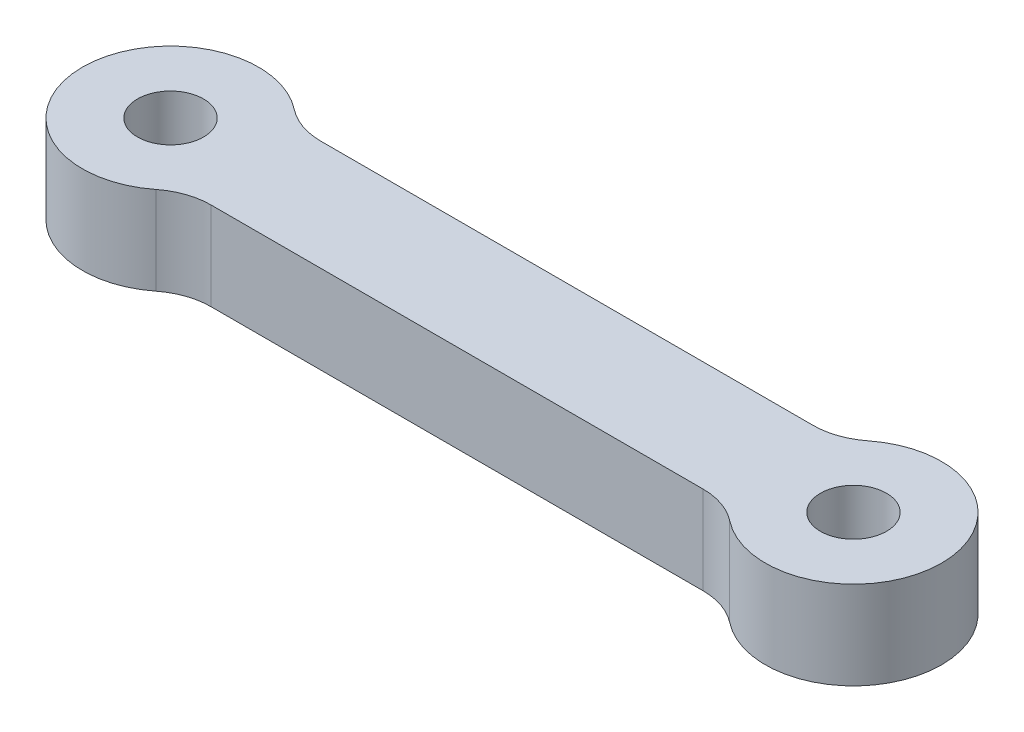
ISO-10303-21;
HEADER;
FILE_DESCRIPTION(('STEP AP214'),'2;1');
FILE_NAME('part.step','',(''),(''),'','','');
FILE_SCHEMA(('AUTOMOTIVE_DESIGN { 1 0 10303 214 1 1 1 1 }'));
ENDSEC;
DATA;
#1=APPLICATION_CONTEXT('core data for automotive mechanical design processes');
#2=APPLICATION_PROTOCOL_DEFINITION('international standard','automotive_design',2000,#1);
#3=PRODUCT_CONTEXT('',#1,'mechanical');
#4=PRODUCT('Part','Part','',(#3));
#5=PRODUCT_RELATED_PRODUCT_CATEGORY('part','',(#4));
#6=PRODUCT_DEFINITION_FORMATION('','',#4);
#7=PRODUCT_DEFINITION_CONTEXT('part definition',#1,'design');
#8=PRODUCT_DEFINITION('design','',#6,#7);
#9=PRODUCT_DEFINITION_SHAPE('','',#8);
#10=(LENGTH_UNIT() NAMED_UNIT(*) SI_UNIT(.MILLI.,.METRE.));
#11=(NAMED_UNIT(*) PLANE_ANGLE_UNIT() SI_UNIT($,.RADIAN.));
#12=(NAMED_UNIT(*) SI_UNIT($,.STERADIAN.) SOLID_ANGLE_UNIT());
#13=UNCERTAINTY_MEASURE_WITH_UNIT(LENGTH_MEASURE(1.E-05),#10,'distance_accuracy_value','');
#14=(GEOMETRIC_REPRESENTATION_CONTEXT(3) GLOBAL_UNCERTAINTY_ASSIGNED_CONTEXT((#13)) GLOBAL_UNIT_ASSIGNED_CONTEXT((#10,
#11,#12)) REPRESENTATION_CONTEXT('',''));
#15=CARTESIAN_POINT('',(0.,0.,0.));
#16=DIRECTION('',(0.,0.,1.));
#17=DIRECTION('',(1.,0.,0.));
#18=AXIS2_PLACEMENT_3D('',#15,#16,#17);
#19=CARTESIAN_POINT('',(11.1698729810778,4.,-5.5));
#20=DIRECTION('',(0.,-1.,0.));
#21=DIRECTION('',(0.,0.,-1.));
#22=AXIS2_PLACEMENT_3D('',#19,#20,#21);
#23=PLANE('',#22);
#24=CARTESIAN_POINT('',(11.1698729810778,4.,-5.5));
#25=DIRECTION('',(0.,-1.,0.));
#26=DIRECTION('',(0.,0.,-1.));
#27=AXIS2_PLACEMENT_3D('',#24,#25,#26);
#28=CIRCLE('',#27,3.);
#29=CARTESIAN_POINT('',(13.025641703473,4.,-3.14285714285714));
#30=VERTEX_POINT('',#29);
#31=CARTESIAN_POINT('',(11.1698729810778,4.,-2.5));
#32=VERTEX_POINT('',#31);
#33=EDGE_CURVE('E145',#30,#32,#28,.T.);
#34=ORIENTED_EDGE('',*,*,#33,.T.);
#35=DIRECTION('',(-1.,0.,0.));
#36=VECTOR('',#35,1.);
#37=CARTESIAN_POINT('',(11.1698729810778,4.,-2.5));
#38=LINE('',#37,#36);
#39=CARTESIAN_POINT('',(-11.1698729810778,4.,-2.5));
#40=VERTEX_POINT('',#39);
#41=EDGE_CURVE('E93',#32,#40,#38,.T.);
#42=ORIENTED_EDGE('',*,*,#41,.T.);
#43=CARTESIAN_POINT('',(-11.1698729810778,4.,-5.5));
#44=DIRECTION('',(0.,-1.,0.));
#45=DIRECTION('',(0.,0.,-1.));
#46=AXIS2_PLACEMENT_3D('',#43,#44,#45);
#47=CIRCLE('',#46,3.);
#48=CARTESIAN_POINT('',(-13.025641703473,4.,-3.14285714285714));
#49=VERTEX_POINT('',#48);
#50=EDGE_CURVE('E160',#40,#49,#47,.T.);
#51=ORIENTED_EDGE('',*,*,#50,.T.);
#52=CARTESIAN_POINT('',(-15.5,4.,0.));
#53=DIRECTION('',(0.,1.,0.));
#54=DIRECTION('',(0.,0.,1.));
#55=AXIS2_PLACEMENT_3D('',#52,#53,#54);
#56=CIRCLE('',#55,4.);
#57=CARTESIAN_POINT('',(-13.025641703473,4.,3.14285714285714));
#58=VERTEX_POINT('',#57);
#59=EDGE_CURVE('E173',#49,#58,#56,.T.);
#60=ORIENTED_EDGE('',*,*,#59,.T.);
#61=CARTESIAN_POINT('',(-11.1698729810778,4.,5.5));
#62=DIRECTION('',(0.,-1.,0.));
#63=DIRECTION('',(0.,0.,1.));
#64=AXIS2_PLACEMENT_3D('',#61,#62,#63);
#65=CIRCLE('',#64,3.);
#66=CARTESIAN_POINT('',(-11.1698729810778,4.,2.5));
#67=VERTEX_POINT('',#66);
#68=EDGE_CURVE('E112',#58,#67,#65,.T.);
#69=ORIENTED_EDGE('',*,*,#68,.T.);
#70=DIRECTION('',(1.,0.,0.));
#71=VECTOR('',#70,1.);
#72=CARTESIAN_POINT('',(11.1698729810778,4.,2.5));
#73=LINE('',#72,#71);
#74=CARTESIAN_POINT('',(11.1698729810778,4.,2.5));
#75=VERTEX_POINT('',#74);
#76=EDGE_CURVE('E106',#67,#75,#73,.T.);
#77=ORIENTED_EDGE('',*,*,#76,.T.);
#78=CARTESIAN_POINT('',(11.1698729810778,4.,5.5));
#79=DIRECTION('',(0.,-1.,0.));
#80=DIRECTION('',(0.,0.,-1.));
#81=AXIS2_PLACEMENT_3D('',#78,#79,#80);
#82=CIRCLE('',#81,3.);
#83=CARTESIAN_POINT('',(13.025641703473,4.,3.14285714285714));
#84=VERTEX_POINT('',#83);
#85=EDGE_CURVE('E110',#75,#84,#82,.T.);
#86=ORIENTED_EDGE('',*,*,#85,.T.);
#87=CARTESIAN_POINT('',(15.5,4.,0.));
#88=DIRECTION('',(0.,1.,0.));
#89=DIRECTION('',(0.,0.,-1.));
#90=AXIS2_PLACEMENT_3D('',#87,#88,#89);
#91=CIRCLE('',#90,4.);
#92=EDGE_CURVE('E50',#84,#30,#91,.T.);
#93=ORIENTED_EDGE('',*,*,#92,.T.);
#94=EDGE_LOOP('',(#34,#42,#51,#60,#69,#77,#86,#93));
#95=FACE_BOUND('',#94,.T.);
#96=CARTESIAN_POINT('',(-15.5,4.,0.));
#97=DIRECTION('',(0.,1.,0.));
#98=DIRECTION('',(0.,0.,1.));
#99=AXIS2_PLACEMENT_3D('',#96,#97,#98);
#100=CIRCLE('',#99,1.5);
#101=CARTESIAN_POINT('',(-15.5,4.,1.5));
#102=VERTEX_POINT('',#101);
#103=EDGE_CURVE('E134',#102,#102,#100,.T.);
#104=ORIENTED_EDGE('',*,*,#103,.F.);
#105=EDGE_LOOP('',(#104));
#106=FACE_BOUND('',#105,.T.);
#107=CARTESIAN_POINT('',(15.5,4.,0.));
#108=DIRECTION('',(0.,1.,0.));
#109=DIRECTION('',(0.,0.,-1.));
#110=AXIS2_PLACEMENT_3D('',#107,#108,#109);
#111=CIRCLE('',#110,1.5);
#112=CARTESIAN_POINT('',(15.5,4.,-1.5));
#113=VERTEX_POINT('',#112);
#114=EDGE_CURVE('E182',#113,#113,#111,.T.);
#115=ORIENTED_EDGE('',*,*,#114,.F.);
#116=EDGE_LOOP('',(#115));
#117=FACE_BOUND('',#116,.T.);
#118=ADVANCED_FACE('F33',(#95,#106,#117),#23,.F.);
#119=CARTESIAN_POINT('',(11.1698729810778,0.,-5.5));
#120=DIRECTION('',(0.,-1.,0.));
#121=DIRECTION('',(0.,0.,-1.));
#122=AXIS2_PLACEMENT_3D('',#119,#120,#121);
#123=PLANE('',#122);
#124=CARTESIAN_POINT('',(-15.5,0.,0.));
#125=DIRECTION('',(0.,1.,0.));
#126=DIRECTION('',(0.,0.,1.));
#127=AXIS2_PLACEMENT_3D('',#124,#125,#126);
#128=CIRCLE('',#127,1.5);
#129=CARTESIAN_POINT('',(-15.5,0.,1.5));
#130=VERTEX_POINT('',#129);
#131=EDGE_CURVE('E179',#130,#130,#128,.T.);
#132=ORIENTED_EDGE('',*,*,#131,.T.);
#133=EDGE_LOOP('',(#132));
#134=FACE_BOUND('',#133,.T.);
#135=CARTESIAN_POINT('',(11.1698729810778,0.,-5.5));
#136=DIRECTION('',(0.,-1.,0.));
#137=DIRECTION('',(0.,0.,-1.));
#138=AXIS2_PLACEMENT_3D('',#135,#136,#137);
#139=CIRCLE('',#138,3.);
#140=CARTESIAN_POINT('',(13.025641703473,0.,-3.14285714285714));
#141=VERTEX_POINT('',#140);
#142=CARTESIAN_POINT('',(11.1698729810778,0.,-2.5));
#143=VERTEX_POINT('',#142);
#144=EDGE_CURVE('E130',#141,#143,#139,.T.);
#145=ORIENTED_EDGE('',*,*,#144,.F.);
#146=CARTESIAN_POINT('',(15.5,0.,0.));
#147=DIRECTION('',(0.,1.,0.));
#148=DIRECTION('',(0.,0.,-1.));
#149=AXIS2_PLACEMENT_3D('',#146,#147,#148);
#150=CIRCLE('',#149,4.);
#151=CARTESIAN_POINT('',(13.025641703473,0.,3.14285714285714));
#152=VERTEX_POINT('',#151);
#153=EDGE_CURVE('E85',#152,#141,#150,.T.);
#154=ORIENTED_EDGE('',*,*,#153,.F.);
#155=CARTESIAN_POINT('',(11.1698729810778,0.,5.5));
#156=DIRECTION('',(0.,-1.,0.));
#157=DIRECTION('',(0.,0.,-1.));
#158=AXIS2_PLACEMENT_3D('',#155,#156,#157);
#159=CIRCLE('',#158,3.);
#160=CARTESIAN_POINT('',(11.1698729810778,0.,2.5));
#161=VERTEX_POINT('',#160);
#162=EDGE_CURVE('E79',#161,#152,#159,.T.);
#163=ORIENTED_EDGE('',*,*,#162,.F.);
#164=DIRECTION('',(1.,0.,0.));
#165=VECTOR('',#164,1.);
#166=CARTESIAN_POINT('',(11.1698729810778,0.,2.5));
#167=LINE('',#166,#165);
#168=CARTESIAN_POINT('',(-11.1698729810778,0.,2.5));
#169=VERTEX_POINT('',#168);
#170=EDGE_CURVE('E120',#169,#161,#167,.T.);
#171=ORIENTED_EDGE('',*,*,#170,.F.);
#172=CARTESIAN_POINT('',(-11.1698729810778,0.,5.5));
#173=DIRECTION('',(0.,-1.,0.));
#174=DIRECTION('',(0.,0.,1.));
#175=AXIS2_PLACEMENT_3D('',#172,#173,#174);
#176=CIRCLE('',#175,3.);
#177=CARTESIAN_POINT('',(-13.025641703473,0.,3.14285714285714));
#178=VERTEX_POINT('',#177);
#179=EDGE_CURVE('E140',#178,#169,#176,.T.);
#180=ORIENTED_EDGE('',*,*,#179,.F.);
#181=CARTESIAN_POINT('',(-15.5,0.,0.));
#182=DIRECTION('',(0.,1.,0.));
#183=DIRECTION('',(0.,0.,1.));
#184=AXIS2_PLACEMENT_3D('',#181,#182,#183);
#185=CIRCLE('',#184,4.);
#186=CARTESIAN_POINT('',(-13.025641703473,0.,-3.14285714285714));
#187=VERTEX_POINT('',#186);
#188=EDGE_CURVE('E138',#187,#178,#185,.T.);
#189=ORIENTED_EDGE('',*,*,#188,.F.);
#190=CARTESIAN_POINT('',(-11.1698729810778,0.,-5.5));
#191=DIRECTION('',(0.,-1.,0.));
#192=DIRECTION('',(0.,0.,-1.));
#193=AXIS2_PLACEMENT_3D('',#190,#191,#192);
#194=CIRCLE('',#193,3.);
#195=CARTESIAN_POINT('',(-11.1698729810778,0.,-2.5));
#196=VERTEX_POINT('',#195);
#197=EDGE_CURVE('E136',#196,#187,#194,.T.);
#198=ORIENTED_EDGE('',*,*,#197,.F.);
#199=DIRECTION('',(-1.,0.,0.));
#200=VECTOR('',#199,1.);
#201=CARTESIAN_POINT('',(11.1698729810778,0.,-2.5));
#202=LINE('',#201,#200);
#203=EDGE_CURVE('E133',#143,#196,#202,.T.);
#204=ORIENTED_EDGE('',*,*,#203,.F.);
#205=EDGE_LOOP('',(#145,#154,#163,#171,#180,#189,#198,#204));
#206=FACE_BOUND('',#205,.T.);
#207=CARTESIAN_POINT('',(15.5,0.,0.));
#208=DIRECTION('',(0.,1.,0.));
#209=DIRECTION('',(0.,0.,-1.));
#210=AXIS2_PLACEMENT_3D('',#207,#208,#209);
#211=CIRCLE('',#210,1.5);
#212=CARTESIAN_POINT('',(15.5,0.,-1.5));
#213=VERTEX_POINT('',#212);
#214=EDGE_CURVE('E185',#213,#213,#211,.T.);
#215=ORIENTED_EDGE('',*,*,#214,.T.);
#216=EDGE_LOOP('',(#215));
#217=FACE_BOUND('',#216,.T.);
#218=ADVANCED_FACE('F164',(#134,#206,#217),#123,.T.);
#219=CARTESIAN_POINT('',(11.1698729810778,4.,-5.5));
#220=DIRECTION('',(0.,-1.,0.));
#221=DIRECTION('',(0.,0.,-1.));
#222=AXIS2_PLACEMENT_3D('',#219,#220,#221);
#223=CYLINDRICAL_SURFACE('',#222,3.);
#224=ORIENTED_EDGE('',*,*,#144,.T.);
#225=DIRECTION('',(0.,-1.,0.));
#226=VECTOR('',#225,1.);
#227=CARTESIAN_POINT('',(11.1698729810778,4.,-2.5));
#228=LINE('',#227,#226);
#229=EDGE_CURVE('E11',#32,#143,#228,.T.);
#230=ORIENTED_EDGE('',*,*,#229,.F.);
#231=ORIENTED_EDGE('',*,*,#33,.F.);
#232=DIRECTION('',(0.,-1.,0.));
#233=VECTOR('',#232,1.);
#234=CARTESIAN_POINT('',(13.025641703473,4.,-3.14285714285714));
#235=LINE('',#234,#233);
#236=EDGE_CURVE('E126',#30,#141,#235,.T.);
#237=ORIENTED_EDGE('',*,*,#236,.T.);
#238=EDGE_LOOP('',(#224,#230,#231,#237));
#239=FACE_BOUND('',#238,.T.);
#240=ADVANCED_FACE('F35',(#239),#223,.F.);
#241=CARTESIAN_POINT('',(11.1698729810778,4.,-2.5));
#242=DIRECTION('',(0.,0.,1.));
#243=DIRECTION('',(1.,0.,0.));
#244=AXIS2_PLACEMENT_3D('',#241,#242,#243);
#245=PLANE('',#244);
#246=ORIENTED_EDGE('',*,*,#203,.T.);
#247=DIRECTION('',(0.,-1.,0.));
#248=VECTOR('',#247,1.);
#249=CARTESIAN_POINT('',(-11.1698729810778,4.,-2.5));
#250=LINE('',#249,#248);
#251=EDGE_CURVE('E42',#40,#196,#250,.T.);
#252=ORIENTED_EDGE('',*,*,#251,.F.);
#253=ORIENTED_EDGE('',*,*,#41,.F.);
#254=ORIENTED_EDGE('',*,*,#229,.T.);
#255=EDGE_LOOP('',(#246,#252,#253,#254));
#256=FACE_BOUND('',#255,.T.);
#257=ADVANCED_FACE('F217',(#256),#245,.F.);
#258=CARTESIAN_POINT('',(-11.1698729810778,4.,-5.5));
#259=DIRECTION('',(0.,-1.,0.));
#260=DIRECTION('',(0.,0.,-1.));
#261=AXIS2_PLACEMENT_3D('',#258,#259,#260);
#262=CYLINDRICAL_SURFACE('',#261,3.);
#263=ORIENTED_EDGE('',*,*,#197,.T.);
#264=DIRECTION('',(0.,-1.,0.));
#265=VECTOR('',#264,1.);
#266=CARTESIAN_POINT('',(-13.025641703473,4.,-3.14285714285714));
#267=LINE('',#266,#265);
#268=EDGE_CURVE('E152',#49,#187,#267,.T.);
#269=ORIENTED_EDGE('',*,*,#268,.F.);
#270=ORIENTED_EDGE('',*,*,#50,.F.);
#271=ORIENTED_EDGE('',*,*,#251,.T.);
#272=EDGE_LOOP('',(#263,#269,#270,#271));
#273=FACE_BOUND('',#272,.T.);
#274=ADVANCED_FACE('F158',(#273),#262,.F.);
#275=CARTESIAN_POINT('',(-15.5,4.,0.));
#276=DIRECTION('',(0.,-1.,0.));
#277=DIRECTION('',(0.,0.,-1.));
#278=AXIS2_PLACEMENT_3D('',#275,#276,#277);
#279=CYLINDRICAL_SURFACE('',#278,4.);
#280=ORIENTED_EDGE('',*,*,#188,.T.);
#281=DIRECTION('',(0.,-1.,0.));
#282=VECTOR('',#281,1.);
#283=CARTESIAN_POINT('',(-13.025641703473,4.,3.14285714285714));
#284=LINE('',#283,#282);
#285=EDGE_CURVE('E149',#58,#178,#284,.T.);
#286=ORIENTED_EDGE('',*,*,#285,.F.);
#287=ORIENTED_EDGE('',*,*,#59,.F.);
#288=ORIENTED_EDGE('',*,*,#268,.T.);
#289=EDGE_LOOP('',(#280,#286,#287,#288));
#290=FACE_BOUND('',#289,.T.);
#291=ADVANCED_FACE('F169',(#290),#279,.T.);
#292=CARTESIAN_POINT('',(-11.1698729810778,4.,5.5));
#293=DIRECTION('',(0.,-1.,0.));
#294=DIRECTION('',(0.,0.,-1.));
#295=AXIS2_PLACEMENT_3D('',#292,#293,#294);
#296=CYLINDRICAL_SURFACE('',#295,3.);
#297=ORIENTED_EDGE('',*,*,#179,.T.);
#298=DIRECTION('',(0.,-1.,0.));
#299=VECTOR('',#298,1.);
#300=CARTESIAN_POINT('',(-11.1698729810778,4.,2.5));
#301=LINE('',#300,#299);
#302=EDGE_CURVE('E121',#67,#169,#301,.T.);
#303=ORIENTED_EDGE('',*,*,#302,.F.);
#304=ORIENTED_EDGE('',*,*,#68,.F.);
#305=ORIENTED_EDGE('',*,*,#285,.T.);
#306=EDGE_LOOP('',(#297,#303,#304,#305));
#307=FACE_BOUND('',#306,.T.);
#308=ADVANCED_FACE('F172',(#307),#296,.F.);
#309=CARTESIAN_POINT('',(11.1698729810778,4.,2.5));
#310=DIRECTION('',(0.,0.,-1.));
#311=DIRECTION('',(-1.,0.,0.));
#312=AXIS2_PLACEMENT_3D('',#309,#310,#311);
#313=PLANE('',#312);
#314=ORIENTED_EDGE('',*,*,#170,.T.);
#315=DIRECTION('',(0.,-1.,0.));
#316=VECTOR('',#315,1.);
#317=CARTESIAN_POINT('',(11.1698729810778,4.,2.5));
#318=LINE('',#317,#316);
#319=EDGE_CURVE('E117',#75,#161,#318,.T.);
#320=ORIENTED_EDGE('',*,*,#319,.F.);
#321=ORIENTED_EDGE('',*,*,#76,.F.);
#322=ORIENTED_EDGE('',*,*,#302,.T.);
#323=EDGE_LOOP('',(#314,#320,#321,#322));
#324=FACE_BOUND('',#323,.T.);
#325=ADVANCED_FACE('F118',(#324),#313,.F.);
#326=CARTESIAN_POINT('',(11.1698729810778,4.,5.5));
#327=DIRECTION('',(0.,-1.,0.));
#328=DIRECTION('',(0.,0.,-1.));
#329=AXIS2_PLACEMENT_3D('',#326,#327,#328);
#330=CYLINDRICAL_SURFACE('',#329,3.);
#331=ORIENTED_EDGE('',*,*,#162,.T.);
#332=DIRECTION('',(0.,-1.,0.));
#333=VECTOR('',#332,1.);
#334=CARTESIAN_POINT('',(13.025641703473,4.,3.14285714285714));
#335=LINE('',#334,#333);
#336=EDGE_CURVE('E122',#84,#152,#335,.T.);
#337=ORIENTED_EDGE('',*,*,#336,.F.);
#338=ORIENTED_EDGE('',*,*,#85,.F.);
#339=ORIENTED_EDGE('',*,*,#319,.T.);
#340=EDGE_LOOP('',(#331,#337,#338,#339));
#341=FACE_BOUND('',#340,.T.);
#342=ADVANCED_FACE('F124',(#341),#330,.F.);
#343=CARTESIAN_POINT('',(15.5,4.,0.));
#344=DIRECTION('',(0.,-1.,0.));
#345=DIRECTION('',(0.,0.,-1.));
#346=AXIS2_PLACEMENT_3D('',#343,#344,#345);
#347=CYLINDRICAL_SURFACE('',#346,4.);
#348=ORIENTED_EDGE('',*,*,#153,.T.);
#349=ORIENTED_EDGE('',*,*,#236,.F.);
#350=ORIENTED_EDGE('',*,*,#92,.F.);
#351=ORIENTED_EDGE('',*,*,#336,.T.);
#352=EDGE_LOOP('',(#348,#349,#350,#351));
#353=FACE_BOUND('',#352,.T.);
#354=ADVANCED_FACE('F205',(#353),#347,.T.);
#355=CARTESIAN_POINT('',(-15.5,4.,0.));
#356=DIRECTION('',(0.,-1.,0.));
#357=DIRECTION('',(0.,0.,-1.));
#358=AXIS2_PLACEMENT_3D('',#355,#356,#357);
#359=CYLINDRICAL_SURFACE('',#358,1.5);
#360=ORIENTED_EDGE('',*,*,#103,.T.);
#361=EDGE_LOOP('',(#360));
#362=FACE_BOUND('',#361,.T.);
#363=ORIENTED_EDGE('',*,*,#131,.F.);
#364=EDGE_LOOP('',(#363));
#365=FACE_BOUND('',#364,.T.);
#366=ADVANCED_FACE('F202',(#362,#365),#359,.F.);
#367=CARTESIAN_POINT('',(15.5,4.,0.));
#368=DIRECTION('',(0.,-1.,0.));
#369=DIRECTION('',(0.,0.,-1.));
#370=AXIS2_PLACEMENT_3D('',#367,#368,#369);
#371=CYLINDRICAL_SURFACE('',#370,1.5);
#372=ORIENTED_EDGE('',*,*,#114,.T.);
#373=EDGE_LOOP('',(#372));
#374=FACE_BOUND('',#373,.T.);
#375=ORIENTED_EDGE('',*,*,#214,.F.);
#376=EDGE_LOOP('',(#375));
#377=FACE_BOUND('',#376,.T.);
#378=ADVANCED_FACE('F191',(#374,#377),#371,.F.);
#379=CLOSED_SHELL('',(#118,#218,#240,#257,#274,#291,#308,#325,#342,#354,#366,#378));
#380=MANIFOLD_SOLID_BREP('B2',#379);
#381=ADVANCED_BREP_SHAPE_REPRESENTATION('',(#18,#380),#14);
#382=SHAPE_DEFINITION_REPRESENTATION(#9,#381);
ENDSEC;
END-ISO-10303-21;
